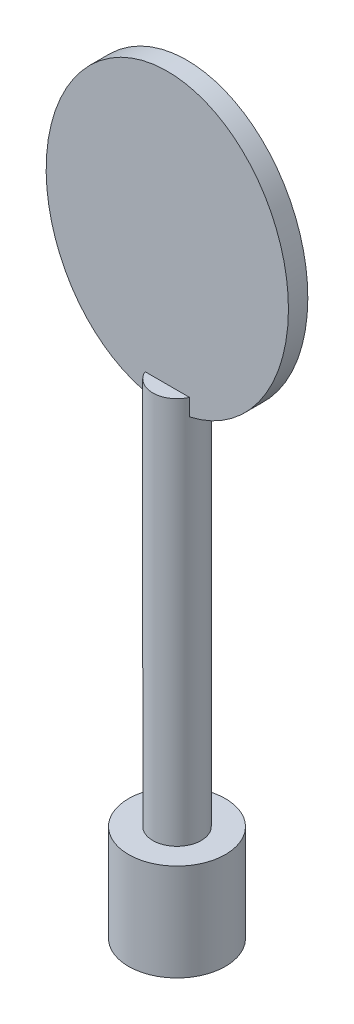
ISO-10303-21;
HEADER;
FILE_DESCRIPTION(('STEP AP214'),'2;1');
FILE_NAME('part.step','',(''),(''),'','','');
FILE_SCHEMA(('AUTOMOTIVE_DESIGN { 1 0 10303 214 1 1 1 1 }'));
ENDSEC;
DATA;
#1=APPLICATION_CONTEXT('core data for automotive mechanical design processes');
#2=APPLICATION_PROTOCOL_DEFINITION('international standard','automotive_design',2000,#1);
#3=PRODUCT_CONTEXT('',#1,'mechanical');
#4=PRODUCT('Part','Part','',(#3));
#5=PRODUCT_RELATED_PRODUCT_CATEGORY('part','',(#4));
#6=PRODUCT_DEFINITION_FORMATION('','',#4);
#7=PRODUCT_DEFINITION_CONTEXT('part definition',#1,'design');
#8=PRODUCT_DEFINITION('design','',#6,#7);
#9=PRODUCT_DEFINITION_SHAPE('','',#8);
#10=(LENGTH_UNIT() NAMED_UNIT(*) SI_UNIT(.MILLI.,.METRE.));
#11=(NAMED_UNIT(*) PLANE_ANGLE_UNIT() SI_UNIT($,.RADIAN.));
#12=(NAMED_UNIT(*) SI_UNIT($,.STERADIAN.) SOLID_ANGLE_UNIT());
#13=UNCERTAINTY_MEASURE_WITH_UNIT(LENGTH_MEASURE(1.E-05),#10,'distance_accuracy_value','');
#14=(GEOMETRIC_REPRESENTATION_CONTEXT(3) GLOBAL_UNCERTAINTY_ASSIGNED_CONTEXT((#13)) GLOBAL_UNIT_ASSIGNED_CONTEXT((#10,
#11,#12)) REPRESENTATION_CONTEXT('',''));
#15=CARTESIAN_POINT('',(0.,0.,0.));
#16=DIRECTION('',(0.,0.,1.));
#17=DIRECTION('',(1.,0.,0.));
#18=AXIS2_PLACEMENT_3D('',#15,#16,#17);
#19=CARTESIAN_POINT('',(0.,500.,0.));
#20=DIRECTION('',(0.,1.,0.));
#21=DIRECTION('',(0.,0.,1.));
#22=AXIS2_PLACEMENT_3D('',#19,#20,#21);
#23=PLANE('',#22);
#24=CARTESIAN_POINT('',(0.,500.,0.));
#25=DIRECTION('',(0.,1.,0.));
#26=DIRECTION('',(0.,0.,1.));
#27=AXIS2_PLACEMENT_3D('',#24,#25,#26);
#28=CIRCLE('',#27,25.);
#29=CARTESIAN_POINT('',(22.9128784747792,500.,-10.));
#30=VERTEX_POINT('',#29);
#31=CARTESIAN_POINT('',(-22.9128784747792,500.,-10.));
#32=VERTEX_POINT('',#31);
#33=EDGE_CURVE('E105',#30,#32,#28,.T.);
#34=ORIENTED_EDGE('',*,*,#33,.T.);
#35=DIRECTION('',(1.,0.,0.));
#36=VECTOR('',#35,1.);
#37=CARTESIAN_POINT('',(0.,500.,-10.));
#38=LINE('',#37,#36);
#39=EDGE_CURVE('E83',#32,#30,#38,.T.);
#40=ORIENTED_EDGE('',*,*,#39,.T.);
#41=EDGE_LOOP('',(#34,#40));
#42=FACE_BOUND('',#41,.T.);
#43=ADVANCED_FACE('F34',(#42),#23,.T.);
#44=CARTESIAN_POINT('',(0.,100.,0.));
#45=DIRECTION('',(0.,-1.,0.));
#46=DIRECTION('',(0.,0.,-1.));
#47=AXIS2_PLACEMENT_3D('',#44,#45,#46);
#48=CYLINDRICAL_SURFACE('',#47,50.);
#49=CARTESIAN_POINT('',(0.,100.,0.));
#50=DIRECTION('',(0.,1.,0.));
#51=DIRECTION('',(0.,0.,1.));
#52=AXIS2_PLACEMENT_3D('',#49,#50,#51);
#53=CIRCLE('',#52,50.);
#54=CARTESIAN_POINT('',(0.,100.,50.));
#55=VERTEX_POINT('',#54);
#56=EDGE_CURVE('E112',#55,#55,#53,.T.);
#57=ORIENTED_EDGE('',*,*,#56,.F.);
#58=EDGE_LOOP('',(#57));
#59=FACE_BOUND('',#58,.T.);
#60=CARTESIAN_POINT('',(0.,0.,0.));
#61=DIRECTION('',(0.,1.,0.));
#62=DIRECTION('',(0.,0.,1.));
#63=AXIS2_PLACEMENT_3D('',#60,#61,#62);
#64=CIRCLE('',#63,50.);
#65=CARTESIAN_POINT('',(0.,0.,50.));
#66=VERTEX_POINT('',#65);
#67=EDGE_CURVE('E115',#66,#66,#64,.T.);
#68=ORIENTED_EDGE('',*,*,#67,.T.);
#69=EDGE_LOOP('',(#68));
#70=FACE_BOUND('',#69,.T.);
#71=ADVANCED_FACE('F36',(#59,#70),#48,.T.);
#72=CARTESIAN_POINT('',(0.,100.,0.));
#73=DIRECTION('',(0.,1.,0.));
#74=DIRECTION('',(0.,0.,1.));
#75=AXIS2_PLACEMENT_3D('',#72,#73,#74);
#76=PLANE('',#75);
#77=CARTESIAN_POINT('',(0.,100.,0.));
#78=DIRECTION('',(0.,1.,0.));
#79=DIRECTION('',(0.,0.,1.));
#80=AXIS2_PLACEMENT_3D('',#77,#78,#79);
#81=CIRCLE('',#80,25.);
#82=CARTESIAN_POINT('',(0.,100.,25.));
#83=VERTEX_POINT('',#82);
#84=EDGE_CURVE('E109',#83,#83,#81,.T.);
#85=ORIENTED_EDGE('',*,*,#84,.F.);
#86=EDGE_LOOP('',(#85));
#87=FACE_BOUND('',#86,.T.);
#88=ORIENTED_EDGE('',*,*,#56,.T.);
#89=EDGE_LOOP('',(#88));
#90=FACE_BOUND('',#89,.T.);
#91=ADVANCED_FACE('F141',(#87,#90),#76,.T.);
#92=CARTESIAN_POINT('',(0.,0.,0.));
#93=DIRECTION('',(0.,1.,0.));
#94=DIRECTION('',(0.,0.,1.));
#95=AXIS2_PLACEMENT_3D('',#92,#93,#94);
#96=PLANE('',#95);
#97=ORIENTED_EDGE('',*,*,#67,.F.);
#98=EDGE_LOOP('',(#97));
#99=FACE_BOUND('',#98,.T.);
#100=ADVANCED_FACE('F148',(#99),#96,.F.);
#101=CARTESIAN_POINT('',(0.,500.,0.));
#102=DIRECTION('',(0.,-1.,0.));
#103=DIRECTION('',(0.,0.,-1.));
#104=AXIS2_PLACEMENT_3D('',#101,#102,#103);
#105=CYLINDRICAL_SURFACE('',#104,25.);
#106=CARTESIAN_POINT('',(-22.9128784747792,500.,10.));
#107=VERTEX_POINT('',#106);
#108=CARTESIAN_POINT('',(22.9128784747792,500.,10.));
#109=VERTEX_POINT('',#108);
#110=EDGE_CURVE('E103',#107,#109,#28,.T.);
#111=ORIENTED_EDGE('',*,*,#110,.F.);
#112=DIRECTION('',(0.,-1.,0.));
#113=VECTOR('',#112,1.);
#114=CARTESIAN_POINT('',(-22.9128784747792,500.,10.));
#115=LINE('',#114,#113);
#116=CARTESIAN_POINT('',(-22.9128784747792,482.541531270666,10.));
#117=VERTEX_POINT('',#116);
#118=EDGE_CURVE('E101',#107,#117,#115,.T.);
#119=ORIENTED_EDGE('',*,*,#118,.T.);
#120=CARTESIAN_POINT('',(-22.9128784747792,482.541531270666,-10.));
#121=CARTESIAN_POINT('',(-23.0955127946993,482.582403385236,-9.58156695357227));
#122=CARTESIAN_POINT('',(-23.2667354927235,482.621214432684,-9.15794652739543));
#123=CARTESIAN_POINT('',(-23.5858523372109,482.694272197949,-8.30157848349402));
#124=CARTESIAN_POINT('',(-23.7337443140554,482.728518491225,-7.86883002115365));
#125=CARTESIAN_POINT('',(-24.0056637570947,482.791997604554,-6.99552052027622));
#126=CARTESIAN_POINT('',(-24.1296906105837,482.821230295887,-6.55495928147339));
#127=CARTESIAN_POINT('',(-24.3534218390468,482.87430415466,-5.66747121344812));
#128=CARTESIAN_POINT('',(-24.4531304727667,482.898146266076,-5.22054551333707));
#129=CARTESIAN_POINT('',(-24.6278927672592,482.940135376311,-4.32163231542116));
#130=CARTESIAN_POINT('',(-24.7029477768457,482.958282686693,-3.86964509593449));
#131=CARTESIAN_POINT('',(-24.7968263576667,482.981053959376,-3.18902257313783));
#132=CARTESIAN_POINT('',(-24.8250012871389,482.987902618636,-2.96171550761442));
#133=CARTESIAN_POINT('',(-24.8751048549955,483.000098974476,-2.50632339768387));
#134=CARTESIAN_POINT('',(-24.8970319674314,483.005446304371,-2.27823817696407));
#135=CARTESIAN_POINT('',(-24.9722360606739,483.023800910257,-1.36408183154171));
#136=CARTESIAN_POINT('',(-25.0003494486526,483.030701028924,-0.675628787872073));
#137=CARTESIAN_POINT('',(-24.9996439889521,483.030528229174,0.701245959773707));
#138=CARTESIAN_POINT('',(-24.9708251808321,483.023455320466,1.3896676637713));
#139=CARTESIAN_POINT('',(-24.8946825297371,483.004873262956,2.30377206297853));
#140=CARTESIAN_POINT('',(-24.8725185217269,482.999468724018,2.53186398471211));
#141=CARTESIAN_POINT('',(-24.8219402472553,482.987158271595,2.98726345243674));
#142=CARTESIAN_POINT('',(-24.7935274900909,482.980252720663,3.21457117439737));
#143=CARTESIAN_POINT('',(-24.6989440633792,482.95731389574,3.89511772676345));
#144=CARTESIAN_POINT('',(-24.623425184252,482.939057699407,4.34701657857499));
#145=CARTESIAN_POINT('',(-24.4477750727513,482.89686407265,5.24554852980486));
#146=CARTESIAN_POINT('',(-24.3476530053004,482.872928757864,5.69218352528308));
#147=CARTESIAN_POINT('',(-24.1516277410139,482.826439732616,6.4664846519545));
#148=CARTESIAN_POINT('',(-24.0610956290894,482.805075424292,6.79559260845039));
#149=CARTESIAN_POINT('',(-23.8666850631161,482.759505363605,7.44968162267174));
#150=CARTESIAN_POINT('',(-23.7628054363112,482.735299361578,7.77466231500202));
#151=CARTESIAN_POINT('',(-23.5420577849039,482.684253428447,8.41946982812642));
#152=CARTESIAN_POINT('',(-23.4252077237072,482.657417146035,8.73930309152115));
#153=CARTESIAN_POINT('',(-23.1786394347512,482.601277198845,9.37371515563295));
#154=CARTESIAN_POINT('',(-23.0489224381957,482.57197377018,9.68829445572906));
#155=CARTESIAN_POINT('',(-22.9128784747792,482.541531270666,10.));
#156=B_SPLINE_CURVE_WITH_KNOTS('',3,(#120,#121,#122,#123,#124,#125,#126,#127,#128,#129,#130,
#131,#132,#133,#134,#135,#136,#137,#138,#139,#140,#141,#142,#143,#144,#145,#146,#147,#148,#149,
#150,#151,#152,#153,#154,#155),.UNSPECIFIED.,.F.,.F.,(4,2,2,2,2,2,2,2,2,2,2,2,2,2,2,2,2,4),(0.,
1.37497105130478,2.75006989147644,4.12520403080573,5.50009717557841,6.87491508663345,
7.56227960180455,8.2498118532414,10.3142960089451,12.378778730146,13.0664035199359,
13.7538624057239,15.1286700297722,16.5029662991384,17.5286866146276,18.5544971149427,
19.5789042388978,20.6032134343685),.UNSPECIFIED.);
#157=CARTESIAN_POINT('',(-22.9128784747792,482.541531270666,-10.));
#158=VERTEX_POINT('',#157);
#159=EDGE_CURVE('E11',#158,#117,#156,.T.);
#160=ORIENTED_EDGE('',*,*,#159,.F.);
#161=DIRECTION('',(0.,-1.,0.));
#162=VECTOR('',#161,1.);
#163=CARTESIAN_POINT('',(-22.9128784747792,500.,-10.));
#164=LINE('',#163,#162);
#165=EDGE_CURVE('E79',#32,#158,#164,.T.);
#166=ORIENTED_EDGE('',*,*,#165,.F.);
#167=ORIENTED_EDGE('',*,*,#33,.F.);
#168=DIRECTION('',(0.,-1.,0.));
#169=VECTOR('',#168,1.);
#170=CARTESIAN_POINT('',(22.9128784747792,500.,-10.));
#171=LINE('',#170,#169);
#172=CARTESIAN_POINT('',(22.9128784747792,482.541531270666,-10.));
#173=VERTEX_POINT('',#172);
#174=EDGE_CURVE('E55',#173,#30,#171,.F.);
#175=ORIENTED_EDGE('',*,*,#174,.F.);
#176=CARTESIAN_POINT('',(22.9128784747792,482.541531270666,10.));
#177=CARTESIAN_POINT('',(23.0955127946993,482.582403385236,9.58156695357227));
#178=CARTESIAN_POINT('',(23.2667354927235,482.621214432684,9.15794652739542));
#179=CARTESIAN_POINT('',(23.5858523372109,482.694272197949,8.30157848349402));
#180=CARTESIAN_POINT('',(23.7337443140554,482.728518491225,7.86883002115365));
#181=CARTESIAN_POINT('',(24.0056637570947,482.791997604554,6.99552052027622));
#182=CARTESIAN_POINT('',(24.1296906105837,482.821230295887,6.55495928147339));
#183=CARTESIAN_POINT('',(24.3534218390468,482.87430415466,5.66747121344812));
#184=CARTESIAN_POINT('',(24.4531304727667,482.898146266076,5.22054551333706));
#185=CARTESIAN_POINT('',(24.6278927672592,482.940135376311,4.32163231542116));
#186=CARTESIAN_POINT('',(24.7029477768457,482.958282686693,3.86964509593449));
#187=CARTESIAN_POINT('',(24.7968263576667,482.981053959376,3.18902257313783));
#188=CARTESIAN_POINT('',(24.8250012871389,482.987902618636,2.96171550761442));
#189=CARTESIAN_POINT('',(24.8751048549955,483.000098974476,2.50632339768386));
#190=CARTESIAN_POINT('',(24.8970319674314,483.005446304371,2.27823817696406));
#191=CARTESIAN_POINT('',(24.9722360606739,483.023800910257,1.3640818315417));
#192=CARTESIAN_POINT('',(25.0003494486526,483.030701028924,0.675628787872066));
#193=CARTESIAN_POINT('',(24.9996439889521,483.030528229174,-0.701245959773717));
#194=CARTESIAN_POINT('',(24.9708251808321,483.023455320466,-1.38966766377131));
#195=CARTESIAN_POINT('',(24.8946825297371,483.004873262956,-2.30377206297854));
#196=CARTESIAN_POINT('',(24.8725185217269,482.999468724018,-2.53186398471212));
#197=CARTESIAN_POINT('',(24.8219402472553,482.987158271595,-2.98726345243675));
#198=CARTESIAN_POINT('',(24.7935274900909,482.980252720663,-3.21457117439738));
#199=CARTESIAN_POINT('',(24.6989440633792,482.95731389574,-3.89511772676346));
#200=CARTESIAN_POINT('',(24.623425184252,482.939057699407,-4.347016578575));
#201=CARTESIAN_POINT('',(24.4477750727513,482.896864072649,-5.24554852980487));
#202=CARTESIAN_POINT('',(24.3476530053004,482.872928757864,-5.69218352528308));
#203=CARTESIAN_POINT('',(24.1516277410139,482.826439732616,-6.46648465195451));
#204=CARTESIAN_POINT('',(24.0610956290894,482.805075424292,-6.7955926084504));
#205=CARTESIAN_POINT('',(23.8666850631161,482.759505363605,-7.44968162267175));
#206=CARTESIAN_POINT('',(23.7628054363112,482.735299361578,-7.77466231500203));
#207=CARTESIAN_POINT('',(23.5420577849039,482.684253428447,-8.41946982812643));
#208=CARTESIAN_POINT('',(23.4252077237072,482.657417146035,-8.73930309152116));
#209=CARTESIAN_POINT('',(23.1786394347512,482.601277198845,-9.37371515563296));
#210=CARTESIAN_POINT('',(23.0489224381957,482.57197377018,-9.68829445572906));
#211=CARTESIAN_POINT('',(22.9128784747792,482.541531270666,-10.));
#212=B_SPLINE_CURVE_WITH_KNOTS('',3,(#176,#177,#178,#179,#180,#181,#182,#183,#184,#185,#186,
#187,#188,#189,#190,#191,#192,#193,#194,#195,#196,#197,#198,#199,#200,#201,#202,#203,#204,#205,
#206,#207,#208,#209,#210,#211),.UNSPECIFIED.,.F.,.F.,(4,2,2,2,2,2,2,2,2,2,2,2,2,2,2,2,2,4),(0.,
1.37497105130478,2.75006989147643,4.12520403080573,5.50009717557841,6.87491508663345,
7.56227960180455,8.2498118532414,10.3142960089451,12.378778730146,13.066403519936,
13.7538624057239,15.1286700297722,16.5029662991384,17.5286866146276,18.5544971149427,
19.5789042388978,20.6032134343685),.UNSPECIFIED.);
#213=CARTESIAN_POINT('',(22.9128784747792,482.541531270666,10.));
#214=VERTEX_POINT('',#213);
#215=EDGE_CURVE('E48',#214,#173,#212,.T.);
#216=ORIENTED_EDGE('',*,*,#215,.F.);
#217=DIRECTION('',(0.,-1.,0.));
#218=VECTOR('',#217,1.);
#219=CARTESIAN_POINT('',(22.9128784747792,500.,10.));
#220=LINE('',#219,#218);
#221=EDGE_CURVE('E88',#214,#109,#220,.F.);
#222=ORIENTED_EDGE('',*,*,#221,.T.);
#223=EDGE_LOOP('',(#111,#119,#160,#166,#167,#175,#216,#222));
#224=FACE_BOUND('',#223,.T.);
#225=ORIENTED_EDGE('',*,*,#84,.T.);
#226=EDGE_LOOP('',(#225));
#227=FACE_BOUND('',#226,.T.);
#228=ADVANCED_FACE('F99',(#224,#227),#105,.T.);
#229=DIRECTION('',(1.,0.,0.));
#230=VECTOR('',#229,1.);
#231=CARTESIAN_POINT('',(0.,500.,10.));
#232=LINE('',#231,#230);
#233=EDGE_CURVE('E63',#107,#109,#232,.T.);
#234=ORIENTED_EDGE('',*,*,#233,.F.);
#235=ORIENTED_EDGE('',*,*,#110,.T.);
#236=EDGE_LOOP('',(#234,#235));
#237=FACE_BOUND('',#236,.T.);
#238=ADVANCED_FACE('F131',(#237),#23,.T.);
#239=CARTESIAN_POINT('',(0.,630.,10.));
#240=DIRECTION('',(0.,0.,1.));
#241=DIRECTION('',(0.,1.,0.));
#242=AXIS2_PLACEMENT_3D('',#239,#240,#241);
#243=ELLIPSE('',#242,150.,125.);
#244=DIRECTION('',(0.,0.,-1.));
#245=VECTOR('',#244,1.);
#246=SURFACE_OF_LINEAR_EXTRUSION('',#243,#245);
#247=EDGE_CURVE('E95',#214,#117,#243,.T.);
#248=ORIENTED_EDGE('',*,*,#247,.F.);
#249=ORIENTED_EDGE('',*,*,#215,.T.);
#250=CARTESIAN_POINT('',(0.,630.,-10.));
#251=DIRECTION('',(0.,0.,1.));
#252=DIRECTION('',(0.,1.,0.));
#253=AXIS2_PLACEMENT_3D('',#250,#251,#252);
#254=ELLIPSE('',#253,150.,125.);
#255=EDGE_CURVE('E82',#173,#158,#254,.T.);
#256=ORIENTED_EDGE('',*,*,#255,.T.);
#257=ORIENTED_EDGE('',*,*,#159,.T.);
#258=EDGE_LOOP('',(#248,#249,#256,#257));
#259=FACE_BOUND('',#258,.T.);
#260=ADVANCED_FACE('F92',(#259),#246,.F.);
#261=CARTESIAN_POINT('',(0.,630.,10.));
#262=DIRECTION('',(0.,0.,1.));
#263=DIRECTION('',(1.,0.,0.));
#264=AXIS2_PLACEMENT_3D('',#261,#262,#263);
#265=PLANE('',#264);
#266=ORIENTED_EDGE('',*,*,#118,.F.);
#267=ORIENTED_EDGE('',*,*,#233,.T.);
#268=ORIENTED_EDGE('',*,*,#221,.F.);
#269=ORIENTED_EDGE('',*,*,#247,.T.);
#270=EDGE_LOOP('',(#266,#267,#268,#269));
#271=FACE_BOUND('',#270,.T.);
#272=ADVANCED_FACE('F130',(#271),#265,.T.);
#273=CARTESIAN_POINT('',(0.,630.,-10.));
#274=DIRECTION('',(0.,0.,1.));
#275=DIRECTION('',(1.,0.,0.));
#276=AXIS2_PLACEMENT_3D('',#273,#274,#275);
#277=PLANE('',#276);
#278=ORIENTED_EDGE('',*,*,#39,.F.);
#279=ORIENTED_EDGE('',*,*,#165,.T.);
#280=ORIENTED_EDGE('',*,*,#255,.F.);
#281=ORIENTED_EDGE('',*,*,#174,.T.);
#282=EDGE_LOOP('',(#278,#279,#280,#281));
#283=FACE_BOUND('',#282,.T.);
#284=ADVANCED_FACE('F81',(#283),#277,.F.);
#285=CLOSED_SHELL('',(#43,#71,#91,#100,#228,#238,#260,#272,#284));
#286=MANIFOLD_SOLID_BREP('B2',#285);
#287=ADVANCED_BREP_SHAPE_REPRESENTATION('',(#18,#286),#14);
#288=SHAPE_DEFINITION_REPRESENTATION(#9,#287);
ENDSEC;
END-ISO-10303-21;
